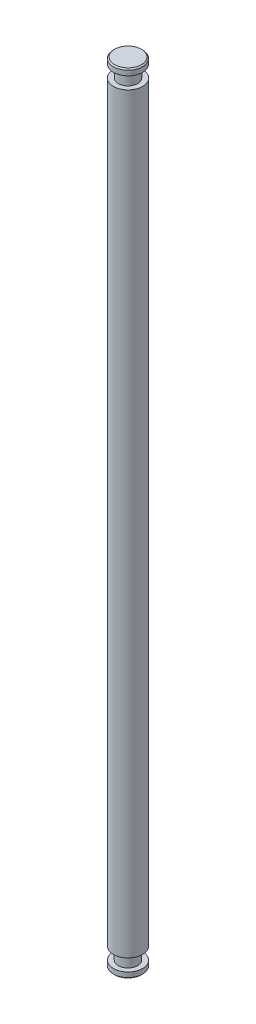
ISO-10303-21;
HEADER;
FILE_DESCRIPTION(('STEP AP214'),'2;1');
FILE_NAME('part.step','',(''),(''),'','','');
FILE_SCHEMA(('AUTOMOTIVE_DESIGN { 1 0 10303 214 1 1 1 1 }'));
ENDSEC;
DATA;
#1=APPLICATION_CONTEXT('core data for automotive mechanical design processes');
#2=APPLICATION_PROTOCOL_DEFINITION('international standard','automotive_design',2000,#1);
#3=PRODUCT_CONTEXT('',#1,'mechanical');
#4=PRODUCT('Part','Part','',(#3));
#5=PRODUCT_RELATED_PRODUCT_CATEGORY('part','',(#4));
#6=PRODUCT_DEFINITION_FORMATION('','',#4);
#7=PRODUCT_DEFINITION_CONTEXT('part definition',#1,'design');
#8=PRODUCT_DEFINITION('design','',#6,#7);
#9=PRODUCT_DEFINITION_SHAPE('','',#8);
#10=(LENGTH_UNIT() NAMED_UNIT(*) SI_UNIT(.MILLI.,.METRE.));
#11=(NAMED_UNIT(*) PLANE_ANGLE_UNIT() SI_UNIT($,.RADIAN.));
#12=(NAMED_UNIT(*) SI_UNIT($,.STERADIAN.) SOLID_ANGLE_UNIT());
#13=UNCERTAINTY_MEASURE_WITH_UNIT(LENGTH_MEASURE(1.E-05),#10,'distance_accuracy_value','');
#14=(GEOMETRIC_REPRESENTATION_CONTEXT(3) GLOBAL_UNCERTAINTY_ASSIGNED_CONTEXT((#13)) GLOBAL_UNIT_ASSIGNED_CONTEXT((#10,
#11,#12)) REPRESENTATION_CONTEXT('',''));
#15=CARTESIAN_POINT('',(0.,0.,0.));
#16=DIRECTION('',(0.,0.,1.));
#17=DIRECTION('',(1.,0.,0.));
#18=AXIS2_PLACEMENT_3D('',#15,#16,#17);
#19=CARTESIAN_POINT('',(0.,324.,0.));
#20=DIRECTION('',(0.,-1.,0.));
#21=DIRECTION('',(0.,0.,-1.));
#22=AXIS2_PLACEMENT_3D('',#19,#20,#21);
#23=CYLINDRICAL_SURFACE('',#22,6.);
#24=CARTESIAN_POINT('',(0.,7.5,0.));
#25=DIRECTION('',(0.,-1.,0.));
#26=DIRECTION('',(0.,0.,-1.));
#27=AXIS2_PLACEMENT_3D('',#24,#25,#26);
#28=CIRCLE('',#27,6.);
#29=CARTESIAN_POINT('',(0.,7.5,-6.));
#30=VERTEX_POINT('',#29);
#31=EDGE_CURVE('E52',#30,#30,#28,.T.);
#32=ORIENTED_EDGE('',*,*,#31,.F.);
#33=EDGE_LOOP('',(#32));
#34=FACE_BOUND('',#33,.T.);
#35=CARTESIAN_POINT('',(0.,316.5,0.));
#36=DIRECTION('',(0.,1.,0.));
#37=DIRECTION('',(0.,0.,1.));
#38=AXIS2_PLACEMENT_3D('',#35,#36,#37);
#39=CIRCLE('',#38,6.);
#40=CARTESIAN_POINT('',(0.,316.5,6.));
#41=VERTEX_POINT('',#40);
#42=EDGE_CURVE('E62',#41,#41,#39,.T.);
#43=ORIENTED_EDGE('',*,*,#42,.F.);
#44=EDGE_LOOP('',(#43));
#45=FACE_BOUND('',#44,.T.);
#46=ADVANCED_FACE('F32',(#34,#45),#23,.T.);
#47=CARTESIAN_POINT('',(0.,7.5,0.));
#48=DIRECTION('',(0.,-1.,0.));
#49=DIRECTION('',(0.,0.,-1.));
#50=AXIS2_PLACEMENT_3D('',#47,#48,#49);
#51=PLANE('',#50);
#52=CARTESIAN_POINT('',(0.,7.5,0.));
#53=DIRECTION('',(0.,-1.,0.));
#54=DIRECTION('',(0.,0.,-1.));
#55=AXIS2_PLACEMENT_3D('',#52,#53,#54);
#56=CIRCLE('',#55,4.);
#57=CARTESIAN_POINT('',(0.,7.5,-4.));
#58=VERTEX_POINT('',#57);
#59=EDGE_CURVE('E56',#58,#58,#56,.T.);
#60=ORIENTED_EDGE('',*,*,#59,.F.);
#61=EDGE_LOOP('',(#60));
#62=FACE_BOUND('',#61,.T.);
#63=ORIENTED_EDGE('',*,*,#31,.T.);
#64=EDGE_LOOP('',(#63));
#65=FACE_BOUND('',#64,.T.);
#66=ADVANCED_FACE('F89',(#62,#65),#51,.T.);
#67=CARTESIAN_POINT('',(0.,2.5,0.));
#68=DIRECTION('',(0.,-1.,0.));
#69=DIRECTION('',(0.,0.,-1.));
#70=AXIS2_PLACEMENT_3D('',#67,#68,#69);
#71=PLANE('',#70);
#72=CARTESIAN_POINT('',(0.,2.5,0.));
#73=DIRECTION('',(0.,-1.,0.));
#74=DIRECTION('',(0.,0.,-1.));
#75=AXIS2_PLACEMENT_3D('',#72,#73,#74);
#76=CIRCLE('',#75,4.);
#77=CARTESIAN_POINT('',(0.,2.5,-4.));
#78=VERTEX_POINT('',#77);
#79=EDGE_CURVE('E59',#78,#78,#76,.T.);
#80=ORIENTED_EDGE('',*,*,#79,.T.);
#81=EDGE_LOOP('',(#80));
#82=FACE_BOUND('',#81,.T.);
#83=CARTESIAN_POINT('',(0.,2.5,0.));
#84=DIRECTION('',(0.,-1.,0.));
#85=DIRECTION('',(0.,0.,-1.));
#86=AXIS2_PLACEMENT_3D('',#83,#84,#85);
#87=CIRCLE('',#86,6.);
#88=CARTESIAN_POINT('',(0.,2.5,-6.));
#89=VERTEX_POINT('',#88);
#90=EDGE_CURVE('E53',#89,#89,#87,.T.);
#91=ORIENTED_EDGE('',*,*,#90,.F.);
#92=EDGE_LOOP('',(#91));
#93=FACE_BOUND('',#92,.T.);
#94=ADVANCED_FACE('F96',(#82,#93),#71,.F.);
#95=CARTESIAN_POINT('',(0.,7.5,0.));
#96=DIRECTION('',(0.,-1.,0.));
#97=DIRECTION('',(0.,0.,-1.));
#98=AXIS2_PLACEMENT_3D('',#95,#96,#97);
#99=CYLINDRICAL_SURFACE('',#98,4.);
#100=ORIENTED_EDGE('',*,*,#59,.T.);
#101=EDGE_LOOP('',(#100));
#102=FACE_BOUND('',#101,.T.);
#103=ORIENTED_EDGE('',*,*,#79,.F.);
#104=EDGE_LOOP('',(#103));
#105=FACE_BOUND('',#104,.T.);
#106=ADVANCED_FACE('F117',(#102,#105),#99,.T.);
#107=CARTESIAN_POINT('',(0.,0.,0.));
#108=DIRECTION('',(0.,1.,0.));
#109=DIRECTION('',(0.,0.,1.));
#110=AXIS2_PLACEMENT_3D('',#107,#108,#109);
#111=PLANE('',#110);
#112=CARTESIAN_POINT('',(0.,0.,0.));
#113=DIRECTION('',(0.,1.,0.));
#114=DIRECTION('',(0.,0.,1.));
#115=AXIS2_PLACEMENT_3D('',#112,#113,#114);
#116=CIRCLE('',#115,5.50000000000003);
#117=CARTESIAN_POINT('',(0.,0.,5.50000000000003));
#118=VERTEX_POINT('',#117);
#119=EDGE_CURVE('E39',#118,#118,#116,.F.);
#120=ORIENTED_EDGE('',*,*,#119,.T.);
#121=EDGE_LOOP('',(#120));
#122=FACE_BOUND('',#121,.T.);
#123=ADVANCED_FACE('F109',(#122),#111,.F.);
#124=CARTESIAN_POINT('',(0.,0.5,0.));
#125=DIRECTION('',(0.,1.,0.));
#126=DIRECTION('',(0.,0.,1.));
#127=AXIS2_PLACEMENT_3D('',#124,#125,#126);
#128=CONICAL_SURFACE('',#127,6.,0.785398163397415);
#129=ORIENTED_EDGE('',*,*,#119,.F.);
#130=EDGE_LOOP('',(#129));
#131=FACE_BOUND('',#130,.T.);
#132=CARTESIAN_POINT('',(0.,0.5,0.));
#133=DIRECTION('',(0.,1.,0.));
#134=DIRECTION('',(0.,0.,1.));
#135=AXIS2_PLACEMENT_3D('',#132,#133,#134);
#136=CIRCLE('',#135,6.);
#137=CARTESIAN_POINT('',(0.,0.5,6.));
#138=VERTEX_POINT('',#137);
#139=EDGE_CURVE('E43',#138,#138,#136,.T.);
#140=ORIENTED_EDGE('',*,*,#139,.F.);
#141=EDGE_LOOP('',(#140));
#142=FACE_BOUND('',#141,.T.);
#143=ADVANCED_FACE('F104',(#131,#142),#128,.T.);
#144=ORIENTED_EDGE('',*,*,#90,.T.);
#145=EDGE_LOOP('',(#144));
#146=FACE_BOUND('',#145,.T.);
#147=ORIENTED_EDGE('',*,*,#139,.T.);
#148=EDGE_LOOP('',(#147));
#149=FACE_BOUND('',#148,.T.);
#150=ADVANCED_FACE('F84',(#146,#149),#23,.T.);
#151=CARTESIAN_POINT('',(0.,316.5,0.));
#152=DIRECTION('',(0.,1.,0.));
#153=DIRECTION('',(0.,0.,1.));
#154=AXIS2_PLACEMENT_3D('',#151,#152,#153);
#155=PLANE('',#154);
#156=CARTESIAN_POINT('',(0.,316.5,0.));
#157=DIRECTION('',(0.,1.,0.));
#158=DIRECTION('',(0.,0.,1.));
#159=AXIS2_PLACEMENT_3D('',#156,#157,#158);
#160=CIRCLE('',#159,4.);
#161=CARTESIAN_POINT('',(0.,316.5,4.));
#162=VERTEX_POINT('',#161);
#163=EDGE_CURVE('E68',#162,#162,#160,.T.);
#164=ORIENTED_EDGE('',*,*,#163,.F.);
#165=EDGE_LOOP('',(#164));
#166=FACE_BOUND('',#165,.T.);
#167=ORIENTED_EDGE('',*,*,#42,.T.);
#168=EDGE_LOOP('',(#167));
#169=FACE_BOUND('',#168,.T.);
#170=ADVANCED_FACE('F80',(#166,#169),#155,.T.);
#171=CARTESIAN_POINT('',(0.,321.5,0.));
#172=DIRECTION('',(0.,1.,0.));
#173=DIRECTION('',(0.,0.,1.));
#174=AXIS2_PLACEMENT_3D('',#171,#172,#173);
#175=PLANE('',#174);
#176=CARTESIAN_POINT('',(0.,321.5,0.));
#177=DIRECTION('',(0.,1.,0.));
#178=DIRECTION('',(0.,0.,1.));
#179=AXIS2_PLACEMENT_3D('',#176,#177,#178);
#180=CIRCLE('',#179,4.);
#181=CARTESIAN_POINT('',(0.,321.5,4.));
#182=VERTEX_POINT('',#181);
#183=EDGE_CURVE('E71',#182,#182,#180,.T.);
#184=ORIENTED_EDGE('',*,*,#183,.T.);
#185=EDGE_LOOP('',(#184));
#186=FACE_BOUND('',#185,.T.);
#187=CARTESIAN_POINT('',(0.,321.5,0.));
#188=DIRECTION('',(0.,1.,0.));
#189=DIRECTION('',(0.,0.,1.));
#190=AXIS2_PLACEMENT_3D('',#187,#188,#189);
#191=CIRCLE('',#190,6.);
#192=CARTESIAN_POINT('',(0.,321.5,6.));
#193=VERTEX_POINT('',#192);
#194=EDGE_CURVE('E65',#193,#193,#191,.T.);
#195=ORIENTED_EDGE('',*,*,#194,.F.);
#196=EDGE_LOOP('',(#195));
#197=FACE_BOUND('',#196,.T.);
#198=ADVANCED_FACE('F83',(#186,#197),#175,.F.);
#199=CARTESIAN_POINT('',(0.,316.5,0.));
#200=DIRECTION('',(0.,1.,0.));
#201=DIRECTION('',(0.,0.,1.));
#202=AXIS2_PLACEMENT_3D('',#199,#200,#201);
#203=CYLINDRICAL_SURFACE('',#202,4.);
#204=ORIENTED_EDGE('',*,*,#163,.T.);
#205=EDGE_LOOP('',(#204));
#206=FACE_BOUND('',#205,.T.);
#207=ORIENTED_EDGE('',*,*,#183,.F.);
#208=EDGE_LOOP('',(#207));
#209=FACE_BOUND('',#208,.T.);
#210=ADVANCED_FACE('F77',(#206,#209),#203,.T.);
#211=CARTESIAN_POINT('',(0.,324.,0.));
#212=DIRECTION('',(0.,1.,0.));
#213=DIRECTION('',(0.,0.,1.));
#214=AXIS2_PLACEMENT_3D('',#211,#212,#213);
#215=PLANE('',#214);
#216=CARTESIAN_POINT('',(0.,324.,0.));
#217=DIRECTION('',(0.,1.,0.));
#218=DIRECTION('',(0.,0.,1.));
#219=AXIS2_PLACEMENT_3D('',#216,#217,#218);
#220=CIRCLE('',#219,5.50000000000001);
#221=CARTESIAN_POINT('',(0.,324.,5.50000000000001));
#222=VERTEX_POINT('',#221);
#223=EDGE_CURVE('E10',#222,#222,#220,.T.);
#224=ORIENTED_EDGE('',*,*,#223,.T.);
#225=EDGE_LOOP('',(#224));
#226=FACE_BOUND('',#225,.T.);
#227=ADVANCED_FACE('F126',(#226),#215,.T.);
#228=CARTESIAN_POINT('',(0.,324.,0.));
#229=DIRECTION('',(0.,-1.,0.));
#230=DIRECTION('',(0.,0.,-1.));
#231=AXIS2_PLACEMENT_3D('',#228,#229,#230);
#232=CONICAL_SURFACE('',#231,5.50000000000001,0.785398163397444);
#233=CARTESIAN_POINT('',(0.,323.5,0.));
#234=DIRECTION('',(0.,1.,0.));
#235=DIRECTION('',(0.,0.,1.));
#236=AXIS2_PLACEMENT_3D('',#233,#234,#235);
#237=CIRCLE('',#236,6.);
#238=CARTESIAN_POINT('',(0.,323.5,6.));
#239=VERTEX_POINT('',#238);
#240=EDGE_CURVE('E47',#239,#239,#237,.F.);
#241=ORIENTED_EDGE('',*,*,#240,.F.);
#242=EDGE_LOOP('',(#241));
#243=FACE_BOUND('',#242,.T.);
#244=ORIENTED_EDGE('',*,*,#223,.F.);
#245=EDGE_LOOP('',(#244));
#246=FACE_BOUND('',#245,.T.);
#247=ADVANCED_FACE('F34',(#243,#246),#232,.T.);
#248=ORIENTED_EDGE('',*,*,#194,.T.);
#249=EDGE_LOOP('',(#248));
#250=FACE_BOUND('',#249,.T.);
#251=ORIENTED_EDGE('',*,*,#240,.T.);
#252=EDGE_LOOP('',(#251));
#253=FACE_BOUND('',#252,.T.);
#254=ADVANCED_FACE('F92',(#250,#253),#23,.T.);
#255=CLOSED_SHELL('',(#46,#66,#94,#106,#123,#143,#150,#170,#198,#210,#227,#247,#254));
#256=MANIFOLD_SOLID_BREP('B2',#255);
#257=ADVANCED_BREP_SHAPE_REPRESENTATION('',(#18,#256),#14);
#258=SHAPE_DEFINITION_REPRESENTATION(#9,#257);
ENDSEC;
END-ISO-10303-21;
